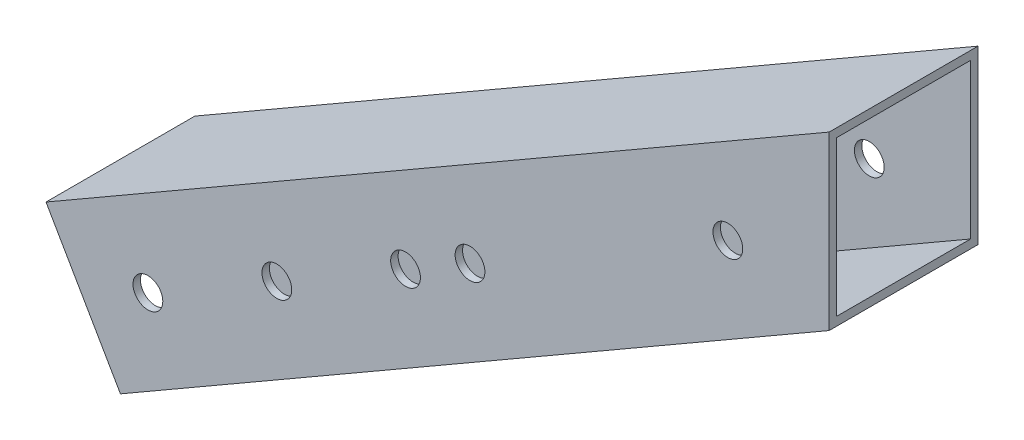
ISO-10303-21;
HEADER;
FILE_DESCRIPTION(('STEP AP214'),'2;1');
FILE_NAME('part.step','',(''),(''),'','','');
FILE_SCHEMA(('AUTOMOTIVE_DESIGN { 1 0 10303 214 1 1 1 1 }'));
ENDSEC;
DATA;
#1=APPLICATION_CONTEXT('core data for automotive mechanical design processes');
#2=APPLICATION_PROTOCOL_DEFINITION('international standard','automotive_design',2000,#1);
#3=PRODUCT_CONTEXT('',#1,'mechanical');
#4=PRODUCT('Part','Part','',(#3));
#5=PRODUCT_RELATED_PRODUCT_CATEGORY('part','',(#4));
#6=PRODUCT_DEFINITION_FORMATION('','',#4);
#7=PRODUCT_DEFINITION_CONTEXT('part definition',#1,'design');
#8=PRODUCT_DEFINITION('design','',#6,#7);
#9=PRODUCT_DEFINITION_SHAPE('','',#8);
#10=(LENGTH_UNIT() NAMED_UNIT(*) SI_UNIT(.MILLI.,.METRE.));
#11=(NAMED_UNIT(*) PLANE_ANGLE_UNIT() SI_UNIT($,.RADIAN.));
#12=(NAMED_UNIT(*) SI_UNIT($,.STERADIAN.) SOLID_ANGLE_UNIT());
#13=UNCERTAINTY_MEASURE_WITH_UNIT(LENGTH_MEASURE(1.E-05),#10,'distance_accuracy_value','');
#14=(GEOMETRIC_REPRESENTATION_CONTEXT(3) GLOBAL_UNCERTAINTY_ASSIGNED_CONTEXT((#13)) GLOBAL_UNIT_ASSIGNED_CONTEXT((#10,
#11,#12)) REPRESENTATION_CONTEXT('',''));
#15=CARTESIAN_POINT('',(0.,0.,0.));
#16=DIRECTION('',(0.,0.,1.));
#17=DIRECTION('',(1.,0.,0.));
#18=AXIS2_PLACEMENT_3D('',#15,#16,#17);
#19=CARTESIAN_POINT('',(43.8802196892921,17.5904043780136,20.));
#20=DIRECTION('',(0.,0.,-1.));
#21=DIRECTION('',(-1.,0.,0.));
#22=AXIS2_PLACEMENT_3D('',#19,#20,#21);
#23=CYLINDRICAL_SURFACE('',#22,2.00000000000003);
#24=CARTESIAN_POINT('',(43.8802196892921,17.5904043780136,19.));
#25=DIRECTION('',(0.,0.,1.));
#26=DIRECTION('',(1.,0.,0.));
#27=AXIS2_PLACEMENT_3D('',#24,#25,#26);
#28=CIRCLE('',#27,2.00000000000003);
#29=CARTESIAN_POINT('',(45.8802196892922,17.5904043780136,19.));
#30=VERTEX_POINT('',#29);
#31=EDGE_CURVE('E178',#30,#30,#28,.T.);
#32=ORIENTED_EDGE('',*,*,#31,.F.);
#33=EDGE_LOOP('',(#32));
#34=FACE_BOUND('',#33,.T.);
#35=CARTESIAN_POINT('',(43.8802196892921,17.5904043780136,20.));
#36=DIRECTION('',(0.,0.,1.));
#37=DIRECTION('',(1.,0.,0.));
#38=AXIS2_PLACEMENT_3D('',#35,#36,#37);
#39=CIRCLE('',#38,2.00000000000003);
#40=CARTESIAN_POINT('',(45.8802196892922,17.5904043780136,20.));
#41=VERTEX_POINT('',#40);
#42=EDGE_CURVE('E219',#41,#41,#39,.T.);
#43=ORIENTED_EDGE('',*,*,#42,.T.);
#44=EDGE_LOOP('',(#43));
#45=FACE_BOUND('',#44,.T.);
#46=ADVANCED_FACE('F45',(#34,#45),#23,.F.);
#47=CARTESIAN_POINT('',(9.23920353791476,-2.40959562198684,20.));
#48=DIRECTION('',(0.,0.,-1.));
#49=DIRECTION('',(-1.,0.,0.));
#50=AXIS2_PLACEMENT_3D('',#47,#48,#49);
#51=CYLINDRICAL_SURFACE('',#50,2.00000000000004);
#52=CARTESIAN_POINT('',(9.23920353791476,-2.40959562198684,19.));
#53=DIRECTION('',(0.,0.,1.));
#54=DIRECTION('',(1.,0.,0.));
#55=AXIS2_PLACEMENT_3D('',#52,#53,#54);
#56=CIRCLE('',#55,2.00000000000004);
#57=CARTESIAN_POINT('',(11.2392035379148,-2.40959562198684,19.));
#58=VERTEX_POINT('',#57);
#59=EDGE_CURVE('E174',#58,#58,#56,.T.);
#60=ORIENTED_EDGE('',*,*,#59,.F.);
#61=EDGE_LOOP('',(#60));
#62=FACE_BOUND('',#61,.T.);
#63=CARTESIAN_POINT('',(9.23920353791476,-2.40959562198684,20.));
#64=DIRECTION('',(0.,0.,1.));
#65=DIRECTION('',(1.,0.,0.));
#66=AXIS2_PLACEMENT_3D('',#63,#64,#65);
#67=CIRCLE('',#66,2.00000000000004);
#68=CARTESIAN_POINT('',(11.2392035379148,-2.40959562198684,20.));
#69=VERTEX_POINT('',#68);
#70=EDGE_CURVE('E211',#69,#69,#67,.T.);
#71=ORIENTED_EDGE('',*,*,#70,.T.);
#72=EDGE_LOOP('',(#71));
#73=FACE_BOUND('',#72,.T.);
#74=ADVANCED_FACE('F296',(#62,#73),#51,.F.);
#75=CARTESIAN_POINT('',(0.578949500070355,-7.40959562198684,20.));
#76=DIRECTION('',(0.,0.,-1.));
#77=DIRECTION('',(-1.,0.,0.));
#78=AXIS2_PLACEMENT_3D('',#75,#76,#77);
#79=CYLINDRICAL_SURFACE('',#78,1.99999999999998);
#80=CARTESIAN_POINT('',(0.578949500070355,-7.40959562198684,19.));
#81=DIRECTION('',(0.,0.,1.));
#82=DIRECTION('',(1.,0.,0.));
#83=AXIS2_PLACEMENT_3D('',#80,#81,#82);
#84=CIRCLE('',#83,1.99999999999998);
#85=CARTESIAN_POINT('',(2.57894950007034,-7.40959562198684,19.));
#86=VERTEX_POINT('',#85);
#87=EDGE_CURVE('E170',#86,#86,#84,.T.);
#88=ORIENTED_EDGE('',*,*,#87,.F.);
#89=EDGE_LOOP('',(#88));
#90=FACE_BOUND('',#89,.T.);
#91=CARTESIAN_POINT('',(0.578949500070355,-7.40959562198684,20.));
#92=DIRECTION('',(0.,0.,1.));
#93=DIRECTION('',(1.,0.,0.));
#94=AXIS2_PLACEMENT_3D('',#91,#92,#93);
#95=CIRCLE('',#94,1.99999999999998);
#96=CARTESIAN_POINT('',(2.57894950007034,-7.40959562198684,20.));
#97=VERTEX_POINT('',#96);
#98=EDGE_CURVE('E203',#97,#97,#95,.T.);
#99=ORIENTED_EDGE('',*,*,#98,.T.);
#100=EDGE_LOOP('',(#99));
#101=FACE_BOUND('',#100,.T.);
#102=ADVANCED_FACE('F304',(#90,#101),#79,.F.);
#103=CARTESIAN_POINT('',(-16.7124371676061,-17.4583033291988,20.));
#104=DIRECTION('',(0.,0.,-1.));
#105=DIRECTION('',(-1.,0.,0.));
#106=AXIS2_PLACEMENT_3D('',#103,#104,#105);
#107=CYLINDRICAL_SURFACE('',#106,2.00000000000001);
#108=CARTESIAN_POINT('',(-16.7124371676061,-17.4583033291988,19.));
#109=DIRECTION('',(0.,0.,1.));
#110=DIRECTION('',(1.,0.,0.));
#111=AXIS2_PLACEMENT_3D('',#108,#109,#110);
#112=CIRCLE('',#111,2.00000000000001);
#113=CARTESIAN_POINT('',(-14.7124371676061,-17.4583033291988,19.));
#114=VERTEX_POINT('',#113);
#115=EDGE_CURVE('E166',#114,#114,#112,.T.);
#116=ORIENTED_EDGE('',*,*,#115,.F.);
#117=EDGE_LOOP('',(#116));
#118=FACE_BOUND('',#117,.T.);
#119=CARTESIAN_POINT('',(-16.7124371676061,-17.4583033291988,20.));
#120=DIRECTION('',(0.,0.,1.));
#121=DIRECTION('',(1.,0.,0.));
#122=AXIS2_PLACEMENT_3D('',#119,#120,#121);
#123=CIRCLE('',#122,2.00000000000001);
#124=CARTESIAN_POINT('',(-14.7124371676061,-17.4583033291988,20.));
#125=VERTEX_POINT('',#124);
#126=EDGE_CURVE('E195',#125,#125,#123,.T.);
#127=ORIENTED_EDGE('',*,*,#126,.T.);
#128=EDGE_LOOP('',(#127));
#129=FACE_BOUND('',#128,.T.);
#130=ADVANCED_FACE('F343',(#118,#129),#107,.F.);
#131=CARTESIAN_POINT('',(-34.0329452432947,-27.4583033291983,20.));
#132=DIRECTION('',(0.,0.,-1.));
#133=DIRECTION('',(-1.,0.,0.));
#134=AXIS2_PLACEMENT_3D('',#131,#132,#133);
#135=CYLINDRICAL_SURFACE('',#134,2.00000000000001);
#136=CARTESIAN_POINT('',(-34.0329452432947,-27.4583033291983,19.));
#137=DIRECTION('',(0.,0.,1.));
#138=DIRECTION('',(1.,0.,0.));
#139=AXIS2_PLACEMENT_3D('',#136,#137,#138);
#140=CIRCLE('',#139,2.00000000000001);
#141=CARTESIAN_POINT('',(-32.0329452432946,-27.4583033291983,19.));
#142=VERTEX_POINT('',#141);
#143=EDGE_CURVE('E165',#142,#142,#140,.T.);
#144=ORIENTED_EDGE('',*,*,#143,.F.);
#145=EDGE_LOOP('',(#144));
#146=FACE_BOUND('',#145,.T.);
#147=CARTESIAN_POINT('',(-34.0329452432947,-27.4583033291983,20.));
#148=DIRECTION('',(0.,0.,1.));
#149=DIRECTION('',(1.,0.,0.));
#150=AXIS2_PLACEMENT_3D('',#147,#148,#149);
#151=CIRCLE('',#150,2.00000000000001);
#152=CARTESIAN_POINT('',(-32.0329452432946,-27.4583033291983,20.));
#153=VERTEX_POINT('',#152);
#154=EDGE_CURVE('E187',#153,#153,#151,.T.);
#155=ORIENTED_EDGE('',*,*,#154,.T.);
#156=EDGE_LOOP('',(#155));
#157=FACE_BOUND('',#156,.T.);
#158=ADVANCED_FACE('F293',(#146,#157),#135,.F.);
#159=CARTESIAN_POINT('',(0.,0.,20.));
#160=DIRECTION('',(0.,0.,1.));
#161=DIRECTION('',(1.,0.,0.));
#162=AXIS2_PLACEMENT_3D('',#159,#160,#161);
#163=PLANE('',#162);
#164=ORIENTED_EDGE('',*,*,#126,.F.);
#165=EDGE_LOOP('',(#164));
#166=FACE_BOUND('',#165,.T.);
#167=ORIENTED_EDGE('',*,*,#70,.F.);
#168=EDGE_LOOP('',(#167));
#169=FACE_BOUND('',#168,.T.);
#170=DIRECTION('',(-0.866025403784438,-0.5,0.));
#171=VECTOR('',#170,1.);
#172=CARTESIAN_POINT('',(57.4847926429663,36.9920136188187,20.));
#173=LINE('',#172,#171);
#174=CARTESIAN_POINT('',(57.4847926429663,36.9920136188187,20.));
#175=VERTEX_POINT('',#174);
#176=CARTESIAN_POINT('',(-47.7223206891512,-23.7493415841429,20.));
#177=VERTEX_POINT('',#176);
#178=EDGE_CURVE('E227',#175,#177,#173,.T.);
#179=ORIENTED_EDGE('',*,*,#178,.T.);
#180=DIRECTION('',(0.499999999999995,-0.866025403784441,0.));
#181=VECTOR('',#180,1.);
#182=CARTESIAN_POINT('',(-47.7223206891512,-23.7493415841429,20.));
#183=LINE('',#182,#181);
#184=CARTESIAN_POINT('',(-37.7223206891512,-41.0698496598318,20.));
#185=VERTEX_POINT('',#184);
#186=EDGE_CURVE('E231',#177,#185,#183,.T.);
#187=ORIENTED_EDGE('',*,*,#186,.T.);
#188=DIRECTION('',(0.866025403784438,0.500000000000002,0.));
#189=VECTOR('',#188,1.);
#190=CARTESIAN_POINT('',(-37.7223206891512,-41.0698496598318,20.));
#191=LINE('',#190,#189);
#192=CARTESIAN_POINT('',(57.4847926429663,13.8980028512337,20.));
#193=VERTEX_POINT('',#192);
#194=EDGE_CURVE('E235',#185,#193,#191,.T.);
#195=ORIENTED_EDGE('',*,*,#194,.T.);
#196=DIRECTION('',(0.,1.,0.));
#197=VECTOR('',#196,1.);
#198=CARTESIAN_POINT('',(57.4847926429663,13.8980028512337,20.));
#199=LINE('',#198,#197);
#200=EDGE_CURVE('E238',#193,#175,#199,.T.);
#201=ORIENTED_EDGE('',*,*,#200,.T.);
#202=EDGE_LOOP('',(#179,#187,#195,#201));
#203=FACE_BOUND('',#202,.T.);
#204=ORIENTED_EDGE('',*,*,#42,.F.);
#205=EDGE_LOOP('',(#204));
#206=FACE_BOUND('',#205,.T.);
#207=ORIENTED_EDGE('',*,*,#98,.F.);
#208=EDGE_LOOP('',(#207));
#209=FACE_BOUND('',#208,.T.);
#210=ORIENTED_EDGE('',*,*,#154,.F.);
#211=EDGE_LOOP('',(#210));
#212=FACE_BOUND('',#211,.T.);
#213=ADVANCED_FACE('F328',(#166,#169,#203,#206,#209,#212),#163,.T.);
#214=CARTESIAN_POINT('',(0.,0.,0.));
#215=DIRECTION('',(0.,0.,1.));
#216=DIRECTION('',(1.,0.,0.));
#217=AXIS2_PLACEMENT_3D('',#214,#215,#216);
#218=PLANE('',#217);
#219=DIRECTION('',(-0.866025403784438,-0.5,0.));
#220=VECTOR('',#219,1.);
#221=CARTESIAN_POINT('',(57.4847926429663,36.9920136188187,0.));
#222=LINE('',#221,#220);
#223=CARTESIAN_POINT('',(57.4847926429663,36.9920136188187,0.));
#224=VERTEX_POINT('',#223);
#225=CARTESIAN_POINT('',(-47.7223206891512,-23.7493415841429,0.));
#226=VERTEX_POINT('',#225);
#227=EDGE_CURVE('E223',#224,#226,#222,.T.);
#228=ORIENTED_EDGE('',*,*,#227,.F.);
#229=DIRECTION('',(0.,1.,0.));
#230=VECTOR('',#229,1.);
#231=CARTESIAN_POINT('',(57.4847926429663,13.8980028512337,0.));
#232=LINE('',#231,#230);
#233=CARTESIAN_POINT('',(57.4847926429663,13.8980028512337,0.));
#234=VERTEX_POINT('',#233);
#235=EDGE_CURVE('E232',#234,#224,#232,.T.);
#236=ORIENTED_EDGE('',*,*,#235,.F.);
#237=DIRECTION('',(0.866025403784438,0.500000000000002,0.));
#238=VECTOR('',#237,1.);
#239=CARTESIAN_POINT('',(-37.7223206891512,-41.0698496598318,0.));
#240=LINE('',#239,#238);
#241=CARTESIAN_POINT('',(-37.7223206891512,-41.0698496598318,0.));
#242=VERTEX_POINT('',#241);
#243=EDGE_CURVE('E248',#242,#234,#240,.T.);
#244=ORIENTED_EDGE('',*,*,#243,.F.);
#245=DIRECTION('',(0.499999999999995,-0.866025403784441,0.));
#246=VECTOR('',#245,1.);
#247=CARTESIAN_POINT('',(-47.7223206891512,-23.7493415841429,0.));
#248=LINE('',#247,#246);
#249=EDGE_CURVE('E245',#226,#242,#248,.T.);
#250=ORIENTED_EDGE('',*,*,#249,.F.);
#251=EDGE_LOOP('',(#228,#236,#244,#250));
#252=FACE_BOUND('',#251,.T.);
#253=CARTESIAN_POINT('',(43.8802196892921,17.5904043780136,0.));
#254=DIRECTION('',(0.,0.,1.));
#255=DIRECTION('',(1.,0.,0.));
#256=AXIS2_PLACEMENT_3D('',#253,#254,#255);
#257=CIRCLE('',#256,2.00000000000003);
#258=CARTESIAN_POINT('',(45.8802196892922,17.5904043780136,0.));
#259=VERTEX_POINT('',#258);
#260=EDGE_CURVE('E215',#259,#259,#257,.T.);
#261=ORIENTED_EDGE('',*,*,#260,.T.);
#262=EDGE_LOOP('',(#261));
#263=FACE_BOUND('',#262,.T.);
#264=CARTESIAN_POINT('',(9.23920353791476,-2.40959562198684,0.));
#265=DIRECTION('',(0.,0.,1.));
#266=DIRECTION('',(1.,0.,0.));
#267=AXIS2_PLACEMENT_3D('',#264,#265,#266);
#268=CIRCLE('',#267,2.00000000000004);
#269=CARTESIAN_POINT('',(11.2392035379148,-2.40959562198684,0.));
#270=VERTEX_POINT('',#269);
#271=EDGE_CURVE('E207',#270,#270,#268,.T.);
#272=ORIENTED_EDGE('',*,*,#271,.T.);
#273=EDGE_LOOP('',(#272));
#274=FACE_BOUND('',#273,.T.);
#275=CARTESIAN_POINT('',(0.578949500070355,-7.40959562198684,0.));
#276=DIRECTION('',(0.,0.,1.));
#277=DIRECTION('',(1.,0.,0.));
#278=AXIS2_PLACEMENT_3D('',#275,#276,#277);
#279=CIRCLE('',#278,1.99999999999998);
#280=CARTESIAN_POINT('',(2.57894950007034,-7.40959562198684,0.));
#281=VERTEX_POINT('',#280);
#282=EDGE_CURVE('E199',#281,#281,#279,.T.);
#283=ORIENTED_EDGE('',*,*,#282,.T.);
#284=EDGE_LOOP('',(#283));
#285=FACE_BOUND('',#284,.T.);
#286=CARTESIAN_POINT('',(-16.7124371676061,-17.4583033291988,0.));
#287=DIRECTION('',(0.,0.,1.));
#288=DIRECTION('',(1.,0.,0.));
#289=AXIS2_PLACEMENT_3D('',#286,#287,#288);
#290=CIRCLE('',#289,2.00000000000001);
#291=CARTESIAN_POINT('',(-14.7124371676061,-17.4583033291988,0.));
#292=VERTEX_POINT('',#291);
#293=EDGE_CURVE('E191',#292,#292,#290,.T.);
#294=ORIENTED_EDGE('',*,*,#293,.T.);
#295=EDGE_LOOP('',(#294));
#296=FACE_BOUND('',#295,.T.);
#297=CARTESIAN_POINT('',(-34.0329452432947,-27.4583033291983,0.));
#298=DIRECTION('',(0.,0.,1.));
#299=DIRECTION('',(1.,0.,0.));
#300=AXIS2_PLACEMENT_3D('',#297,#298,#299);
#301=CIRCLE('',#300,2.00000000000001);
#302=CARTESIAN_POINT('',(-32.0329452432946,-27.4583033291983,0.));
#303=VERTEX_POINT('',#302);
#304=EDGE_CURVE('E186',#303,#303,#301,.T.);
#305=ORIENTED_EDGE('',*,*,#304,.T.);
#306=EDGE_LOOP('',(#305));
#307=FACE_BOUND('',#306,.T.);
#308=ADVANCED_FACE('F325',(#252,#263,#274,#285,#296,#307),#218,.F.);
#309=CARTESIAN_POINT('',(57.4847926429663,36.9920136188187,20.));
#310=DIRECTION('',(0.5,-0.866025403784439,0.));
#311=DIRECTION('',(0.866025403784439,0.5,0.));
#312=AXIS2_PLACEMENT_3D('',#309,#310,#311);
#313=PLANE('',#312);
#314=ORIENTED_EDGE('',*,*,#227,.T.);
#315=DIRECTION('',(0.,0.,-1.));
#316=VECTOR('',#315,1.);
#317=CARTESIAN_POINT('',(-47.7223206891512,-23.7493415841429,20.));
#318=LINE('',#317,#316);
#319=EDGE_CURVE('E264',#177,#226,#318,.T.);
#320=ORIENTED_EDGE('',*,*,#319,.F.);
#321=ORIENTED_EDGE('',*,*,#178,.F.);
#322=DIRECTION('',(0.,0.,-1.));
#323=VECTOR('',#322,1.);
#324=CARTESIAN_POINT('',(57.4847926429663,36.9920136188187,20.));
#325=LINE('',#324,#323);
#326=EDGE_CURVE('E241',#175,#224,#325,.T.);
#327=ORIENTED_EDGE('',*,*,#326,.T.);
#328=EDGE_LOOP('',(#314,#320,#321,#327));
#329=FACE_BOUND('',#328,.T.);
#330=ADVANCED_FACE('F47',(#329),#313,.F.);
#331=CARTESIAN_POINT('',(-47.7223206891512,-23.7493415841429,20.));
#332=DIRECTION('',(0.866025403784441,0.499999999999995,0.));
#333=DIRECTION('',(-0.499999999999995,0.866025403784441,0.));
#334=AXIS2_PLACEMENT_3D('',#331,#332,#333);
#335=PLANE('',#334);
#336=DIRECTION('',(0.,0.,-1.));
#337=VECTOR('',#336,1.);
#338=CARTESIAN_POINT('',(-47.2223206891511,-24.6153669879274,1.));
#339=LINE('',#338,#337);
#340=CARTESIAN_POINT('',(-47.2223206891511,-24.6153669879274,19.));
#341=VERTEX_POINT('',#340);
#342=CARTESIAN_POINT('',(-47.2223206891511,-24.6153669879274,1.));
#343=VERTEX_POINT('',#342);
#344=EDGE_CURVE('E124',#341,#343,#339,.T.);
#345=ORIENTED_EDGE('',*,*,#344,.F.);
#346=DIRECTION('',(-0.499999999999995,0.866025403784442,0.));
#347=VECTOR('',#346,1.);
#348=CARTESIAN_POINT('',(-47.2223206891511,-24.6153669879274,19.));
#349=LINE('',#348,#347);
#350=CARTESIAN_POINT('',(-38.2223206891512,-40.2038242560473,19.));
#351=VERTEX_POINT('',#350);
#352=EDGE_CURVE('E61',#351,#341,#349,.T.);
#353=ORIENTED_EDGE('',*,*,#352,.F.);
#354=DIRECTION('',(0.,0.,1.));
#355=VECTOR('',#354,1.);
#356=CARTESIAN_POINT('',(-38.2223206891512,-40.2038242560473,1.));
#357=LINE('',#356,#355);
#358=CARTESIAN_POINT('',(-38.2223206891512,-40.2038242560473,1.));
#359=VERTEX_POINT('',#358);
#360=EDGE_CURVE('E132',#359,#351,#357,.T.);
#361=ORIENTED_EDGE('',*,*,#360,.F.);
#362=DIRECTION('',(0.499999999999995,-0.866025403784442,0.));
#363=VECTOR('',#362,1.);
#364=CARTESIAN_POINT('',(-47.2223206891511,-24.6153669879274,1.));
#365=LINE('',#364,#363);
#366=EDGE_CURVE('E114',#343,#359,#365,.T.);
#367=ORIENTED_EDGE('',*,*,#366,.F.);
#368=EDGE_LOOP('',(#345,#353,#361,#367));
#369=FACE_BOUND('',#368,.T.);
#370=ORIENTED_EDGE('',*,*,#249,.T.);
#371=DIRECTION('',(0.,0.,-1.));
#372=VECTOR('',#371,1.);
#373=CARTESIAN_POINT('',(-37.7223206891512,-41.0698496598318,20.));
#374=LINE('',#373,#372);
#375=EDGE_CURVE('E260',#185,#242,#374,.T.);
#376=ORIENTED_EDGE('',*,*,#375,.F.);
#377=ORIENTED_EDGE('',*,*,#186,.F.);
#378=ORIENTED_EDGE('',*,*,#319,.T.);
#379=EDGE_LOOP('',(#370,#376,#377,#378));
#380=FACE_BOUND('',#379,.T.);
#381=ADVANCED_FACE('F129',(#369,#380),#335,.F.);
#382=CARTESIAN_POINT('',(-37.7223206891512,-41.0698496598318,20.));
#383=DIRECTION('',(-0.500000000000002,0.866025403784438,0.));
#384=DIRECTION('',(-0.866025403784438,-0.500000000000002,0.));
#385=AXIS2_PLACEMENT_3D('',#382,#383,#384);
#386=PLANE('',#385);
#387=ORIENTED_EDGE('',*,*,#243,.T.);
#388=DIRECTION('',(0.,0.,-1.));
#389=VECTOR('',#388,1.);
#390=CARTESIAN_POINT('',(57.4847926429663,13.8980028512337,20.));
#391=LINE('',#390,#389);
#392=EDGE_CURVE('E256',#193,#234,#391,.T.);
#393=ORIENTED_EDGE('',*,*,#392,.F.);
#394=ORIENTED_EDGE('',*,*,#194,.F.);
#395=ORIENTED_EDGE('',*,*,#375,.T.);
#396=EDGE_LOOP('',(#387,#393,#394,#395));
#397=FACE_BOUND('',#396,.T.);
#398=ADVANCED_FACE('F319',(#397),#386,.F.);
#399=CARTESIAN_POINT('',(57.4847926429663,13.8980028512337,20.));
#400=DIRECTION('',(-1.,0.,0.));
#401=DIRECTION('',(0.,0.,1.));
#402=AXIS2_PLACEMENT_3D('',#399,#400,#401);
#403=PLANE('',#402);
#404=DIRECTION('',(0.,0.,1.));
#405=VECTOR('',#404,1.);
#406=CARTESIAN_POINT('',(57.4847926429663,15.052703389612,20.));
#407=LINE('',#406,#405);
#408=CARTESIAN_POINT('',(57.4847926429663,15.052703389612,1.));
#409=VERTEX_POINT('',#408);
#410=CARTESIAN_POINT('',(57.4847926429663,15.052703389612,19.));
#411=VERTEX_POINT('',#410);
#412=EDGE_CURVE('E11',#409,#411,#407,.T.);
#413=ORIENTED_EDGE('',*,*,#412,.T.);
#414=DIRECTION('',(0.,1.,0.));
#415=VECTOR('',#414,1.);
#416=CARTESIAN_POINT('',(57.4847926429663,13.8980028512337,19.));
#417=LINE('',#416,#415);
#418=CARTESIAN_POINT('',(57.4847926429663,35.8373130804385,19.));
#419=VERTEX_POINT('',#418);
#420=EDGE_CURVE('E182',#411,#419,#417,.T.);
#421=ORIENTED_EDGE('',*,*,#420,.T.);
#422=DIRECTION('',(0.,0.,-1.));
#423=VECTOR('',#422,1.);
#424=CARTESIAN_POINT('',(57.4847926429663,35.8373130804385,20.));
#425=LINE('',#424,#423);
#426=CARTESIAN_POINT('',(57.4847926429663,35.8373130804385,1.));
#427=VERTEX_POINT('',#426);
#428=EDGE_CURVE('E54',#419,#427,#425,.T.);
#429=ORIENTED_EDGE('',*,*,#428,.T.);
#430=DIRECTION('',(0.,-1.,0.));
#431=VECTOR('',#430,1.);
#432=CARTESIAN_POINT('',(57.4847926429663,13.8980028512337,1.));
#433=LINE('',#432,#431);
#434=EDGE_CURVE('E117',#427,#409,#433,.T.);
#435=ORIENTED_EDGE('',*,*,#434,.T.);
#436=EDGE_LOOP('',(#413,#421,#429,#435));
#437=FACE_BOUND('',#436,.T.);
#438=ORIENTED_EDGE('',*,*,#235,.T.);
#439=ORIENTED_EDGE('',*,*,#326,.F.);
#440=ORIENTED_EDGE('',*,*,#200,.F.);
#441=ORIENTED_EDGE('',*,*,#392,.T.);
#442=EDGE_LOOP('',(#438,#439,#440,#441));
#443=FACE_BOUND('',#442,.T.);
#444=ADVANCED_FACE('F275',(#437,#443),#403,.F.);
#445=CARTESIAN_POINT('',(43.8802196892921,17.5904043780136,1.));
#446=DIRECTION('',(0.,0.,-1.));
#447=DIRECTION('',(-1.,0.,0.));
#448=AXIS2_PLACEMENT_3D('',#445,#446,#447);
#449=CIRCLE('',#448,2.00000000000003);
#450=CARTESIAN_POINT('',(41.8802196892921,17.5904043780136,1.));
#451=VERTEX_POINT('',#450);
#452=EDGE_CURVE('E159',#451,#451,#449,.T.);
#453=ORIENTED_EDGE('',*,*,#452,.F.);
#454=EDGE_LOOP('',(#453));
#455=FACE_BOUND('',#454,.T.);
#456=ORIENTED_EDGE('',*,*,#260,.F.);
#457=EDGE_LOOP('',(#456));
#458=FACE_BOUND('',#457,.T.);
#459=ADVANCED_FACE('F299',(#455,#458),#23,.F.);
#460=CARTESIAN_POINT('',(9.23920353791476,-2.40959562198684,1.));
#461=DIRECTION('',(0.,0.,-1.));
#462=DIRECTION('',(-1.,0.,0.));
#463=AXIS2_PLACEMENT_3D('',#460,#461,#462);
#464=CIRCLE('',#463,2.00000000000004);
#465=CARTESIAN_POINT('',(7.23920353791472,-2.40959562198684,1.));
#466=VERTEX_POINT('',#465);
#467=EDGE_CURVE('E155',#466,#466,#464,.T.);
#468=ORIENTED_EDGE('',*,*,#467,.F.);
#469=EDGE_LOOP('',(#468));
#470=FACE_BOUND('',#469,.T.);
#471=ORIENTED_EDGE('',*,*,#271,.F.);
#472=EDGE_LOOP('',(#471));
#473=FACE_BOUND('',#472,.T.);
#474=ADVANCED_FACE('F307',(#470,#473),#51,.F.);
#475=CARTESIAN_POINT('',(0.578949500070355,-7.40959562198684,1.));
#476=DIRECTION('',(0.,0.,-1.));
#477=DIRECTION('',(-1.,0.,0.));
#478=AXIS2_PLACEMENT_3D('',#475,#476,#477);
#479=CIRCLE('',#478,1.99999999999998);
#480=CARTESIAN_POINT('',(-1.42105049992963,-7.40959562198684,1.));
#481=VERTEX_POINT('',#480);
#482=EDGE_CURVE('E151',#481,#481,#479,.T.);
#483=ORIENTED_EDGE('',*,*,#482,.F.);
#484=EDGE_LOOP('',(#483));
#485=FACE_BOUND('',#484,.T.);
#486=ORIENTED_EDGE('',*,*,#282,.F.);
#487=EDGE_LOOP('',(#486));
#488=FACE_BOUND('',#487,.T.);
#489=ADVANCED_FACE('F317',(#485,#488),#79,.F.);
#490=CARTESIAN_POINT('',(-16.7124371676061,-17.4583033291988,1.));
#491=DIRECTION('',(0.,0.,-1.));
#492=DIRECTION('',(-1.,0.,0.));
#493=AXIS2_PLACEMENT_3D('',#490,#491,#492);
#494=CIRCLE('',#493,2.00000000000001);
#495=CARTESIAN_POINT('',(-18.7124371676061,-17.4583033291988,1.));
#496=VERTEX_POINT('',#495);
#497=EDGE_CURVE('E147',#496,#496,#494,.T.);
#498=ORIENTED_EDGE('',*,*,#497,.F.);
#499=EDGE_LOOP('',(#498));
#500=FACE_BOUND('',#499,.T.);
#501=ORIENTED_EDGE('',*,*,#293,.F.);
#502=EDGE_LOOP('',(#501));
#503=FACE_BOUND('',#502,.T.);
#504=ADVANCED_FACE('F290',(#500,#503),#107,.F.);
#505=CARTESIAN_POINT('',(-34.0329452432947,-27.4583033291983,1.));
#506=DIRECTION('',(0.,0.,-1.));
#507=DIRECTION('',(-1.,0.,0.));
#508=AXIS2_PLACEMENT_3D('',#505,#506,#507);
#509=CIRCLE('',#508,2.00000000000001);
#510=CARTESIAN_POINT('',(-36.0329452432947,-27.4583033291983,1.));
#511=VERTEX_POINT('',#510);
#512=EDGE_CURVE('E142',#511,#511,#509,.T.);
#513=ORIENTED_EDGE('',*,*,#512,.F.);
#514=EDGE_LOOP('',(#513));
#515=FACE_BOUND('',#514,.T.);
#516=ORIENTED_EDGE('',*,*,#304,.F.);
#517=EDGE_LOOP('',(#516));
#518=FACE_BOUND('',#517,.T.);
#519=ADVANCED_FACE('F283',(#515,#518),#135,.F.);
#520=CARTESIAN_POINT('',(66.9847926429667,20.5375309469136,1.));
#521=DIRECTION('',(0.499999999999995,-0.866025403784441,0.));
#522=DIRECTION('',(0.866025403784441,0.499999999999995,0.));
#523=AXIS2_PLACEMENT_3D('',#520,#521,#522);
#524=PLANE('',#523);
#525=DIRECTION('',(-0.866025403784441,-0.499999999999995,0.));
#526=VECTOR('',#525,1.);
#527=CARTESIAN_POINT('',(66.9847926429667,20.5375309469136,1.));
#528=LINE('',#527,#526);
#529=EDGE_CURVE('E120',#409,#359,#528,.T.);
#530=ORIENTED_EDGE('',*,*,#529,.T.);
#531=ORIENTED_EDGE('',*,*,#360,.T.);
#532=DIRECTION('',(-0.866025403784441,-0.499999999999995,0.));
#533=VECTOR('',#532,1.);
#534=CARTESIAN_POINT('',(66.9847926429667,20.5375309469136,19.));
#535=LINE('',#534,#533);
#536=EDGE_CURVE('E139',#411,#351,#535,.T.);
#537=ORIENTED_EDGE('',*,*,#536,.F.);
#538=ORIENTED_EDGE('',*,*,#412,.F.);
#539=EDGE_LOOP('',(#530,#531,#537,#538));
#540=FACE_BOUND('',#539,.T.);
#541=ADVANCED_FACE('F280',(#540),#524,.F.);
#542=CARTESIAN_POINT('',(57.9847926429668,36.1259882150335,1.));
#543=DIRECTION('',(-0.499999999999995,0.866025403784441,0.));
#544=DIRECTION('',(-0.866025403784441,-0.499999999999995,0.));
#545=AXIS2_PLACEMENT_3D('',#542,#543,#544);
#546=PLANE('',#545);
#547=DIRECTION('',(-0.866025403784441,-0.499999999999995,0.));
#548=VECTOR('',#547,1.);
#549=CARTESIAN_POINT('',(57.9847926429668,36.1259882150335,19.));
#550=LINE('',#549,#548);
#551=EDGE_CURVE('E121',#419,#341,#550,.T.);
#552=ORIENTED_EDGE('',*,*,#551,.T.);
#553=ORIENTED_EDGE('',*,*,#344,.T.);
#554=DIRECTION('',(-0.866025403784441,-0.499999999999995,0.));
#555=VECTOR('',#554,1.);
#556=CARTESIAN_POINT('',(57.9847926429668,36.1259882150335,1.));
#557=LINE('',#556,#555);
#558=EDGE_CURVE('E69',#427,#343,#557,.T.);
#559=ORIENTED_EDGE('',*,*,#558,.F.);
#560=ORIENTED_EDGE('',*,*,#428,.F.);
#561=EDGE_LOOP('',(#552,#553,#559,#560));
#562=FACE_BOUND('',#561,.T.);
#563=ADVANCED_FACE('F125',(#562),#546,.F.);
#564=CARTESIAN_POINT('',(57.9847926429668,36.1259882150335,19.));
#565=DIRECTION('',(0.,0.,1.));
#566=DIRECTION('',(1.,0.,0.));
#567=AXIS2_PLACEMENT_3D('',#564,#565,#566);
#568=PLANE('',#567);
#569=ORIENTED_EDGE('',*,*,#31,.T.);
#570=EDGE_LOOP('',(#569));
#571=FACE_BOUND('',#570,.T.);
#572=ORIENTED_EDGE('',*,*,#59,.T.);
#573=EDGE_LOOP('',(#572));
#574=FACE_BOUND('',#573,.T.);
#575=ORIENTED_EDGE('',*,*,#87,.T.);
#576=EDGE_LOOP('',(#575));
#577=FACE_BOUND('',#576,.T.);
#578=ORIENTED_EDGE('',*,*,#115,.T.);
#579=EDGE_LOOP('',(#578));
#580=FACE_BOUND('',#579,.T.);
#581=ORIENTED_EDGE('',*,*,#143,.T.);
#582=EDGE_LOOP('',(#581));
#583=FACE_BOUND('',#582,.T.);
#584=ORIENTED_EDGE('',*,*,#536,.T.);
#585=ORIENTED_EDGE('',*,*,#352,.T.);
#586=ORIENTED_EDGE('',*,*,#551,.F.);
#587=ORIENTED_EDGE('',*,*,#420,.F.);
#588=EDGE_LOOP('',(#584,#585,#586,#587));
#589=FACE_BOUND('',#588,.T.);
#590=ADVANCED_FACE('F277',(#571,#574,#577,#580,#583,#589),#568,.F.);
#591=CARTESIAN_POINT('',(57.9847926429668,36.1259882150335,1.));
#592=DIRECTION('',(0.,0.,-1.));
#593=DIRECTION('',(-1.,0.,0.));
#594=AXIS2_PLACEMENT_3D('',#591,#592,#593);
#595=PLANE('',#594);
#596=ORIENTED_EDGE('',*,*,#452,.T.);
#597=EDGE_LOOP('',(#596));
#598=FACE_BOUND('',#597,.T.);
#599=ORIENTED_EDGE('',*,*,#467,.T.);
#600=EDGE_LOOP('',(#599));
#601=FACE_BOUND('',#600,.T.);
#602=ORIENTED_EDGE('',*,*,#482,.T.);
#603=EDGE_LOOP('',(#602));
#604=FACE_BOUND('',#603,.T.);
#605=ORIENTED_EDGE('',*,*,#497,.T.);
#606=EDGE_LOOP('',(#605));
#607=FACE_BOUND('',#606,.T.);
#608=ORIENTED_EDGE('',*,*,#512,.T.);
#609=EDGE_LOOP('',(#608));
#610=FACE_BOUND('',#609,.T.);
#611=ORIENTED_EDGE('',*,*,#558,.T.);
#612=ORIENTED_EDGE('',*,*,#366,.T.);
#613=ORIENTED_EDGE('',*,*,#529,.F.);
#614=ORIENTED_EDGE('',*,*,#434,.F.);
#615=EDGE_LOOP('',(#611,#612,#613,#614));
#616=FACE_BOUND('',#615,.T.);
#617=ADVANCED_FACE('F111',(#598,#601,#604,#607,#610,#616),#595,.F.);
#618=CLOSED_SHELL('',(#46,#74,#102,#130,#158,#213,#308,#330,#381,#398,#444,#459,#474,#489,#504,
#519,#541,#563,#590,#617));
#619=MANIFOLD_SOLID_BREP('B2',#618);
#620=ADVANCED_BREP_SHAPE_REPRESENTATION('',(#18,#619),#14);
#621=SHAPE_DEFINITION_REPRESENTATION(#9,#620);
ENDSEC;
END-ISO-10303-21;
